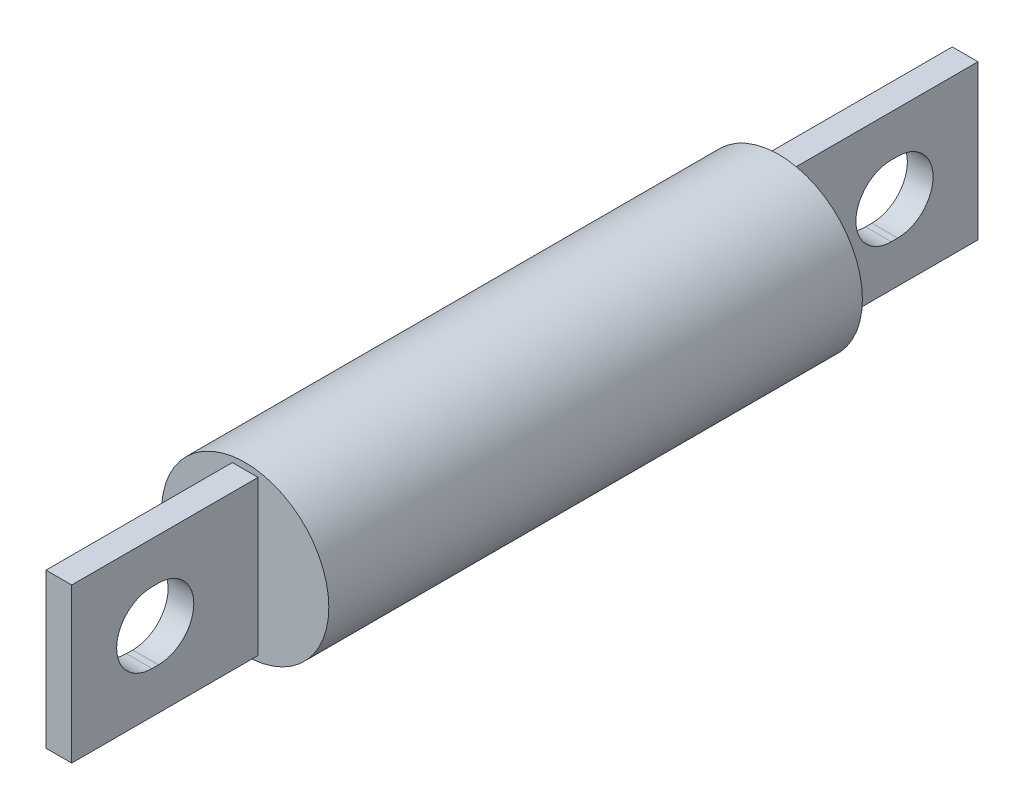
ISO-10303-21;
HEADER;
FILE_DESCRIPTION(('STEP AP214'),'2;1');
FILE_NAME('part.step','',(''),(''),'','','');
FILE_SCHEMA(('AUTOMOTIVE_DESIGN { 1 0 10303 214 1 1 1 1 }'));
ENDSEC;
DATA;
#1=APPLICATION_CONTEXT('core data for automotive mechanical design processes');
#2=APPLICATION_PROTOCOL_DEFINITION('international standard','automotive_design',2000,#1);
#3=PRODUCT_CONTEXT('',#1,'mechanical');
#4=PRODUCT('Part','Part','',(#3));
#5=PRODUCT_RELATED_PRODUCT_CATEGORY('part','',(#4));
#6=PRODUCT_DEFINITION_FORMATION('','',#4);
#7=PRODUCT_DEFINITION_CONTEXT('part definition',#1,'design');
#8=PRODUCT_DEFINITION('design','',#6,#7);
#9=PRODUCT_DEFINITION_SHAPE('','',#8);
#10=(LENGTH_UNIT() NAMED_UNIT(*) SI_UNIT(.MILLI.,.METRE.));
#11=(NAMED_UNIT(*) PLANE_ANGLE_UNIT() SI_UNIT($,.RADIAN.));
#12=(NAMED_UNIT(*) SI_UNIT($,.STERADIAN.) SOLID_ANGLE_UNIT());
#13=UNCERTAINTY_MEASURE_WITH_UNIT(LENGTH_MEASURE(1.E-05),#10,'distance_accuracy_value','');
#14=(GEOMETRIC_REPRESENTATION_CONTEXT(3) GLOBAL_UNCERTAINTY_ASSIGNED_CONTEXT((#13)) GLOBAL_UNIT_ASSIGNED_CONTEXT((#10,
#11,#12)) REPRESENTATION_CONTEXT('',''));
#15=CARTESIAN_POINT('',(0.,0.,0.));
#16=DIRECTION('',(0.,0.,1.));
#17=DIRECTION('',(1.,0.,0.));
#18=AXIS2_PLACEMENT_3D('',#15,#16,#17);
#19=CARTESIAN_POINT('',(0.,0.,32.9438));
#20=DIRECTION('',(0.,0.,1.));
#21=DIRECTION('',(1.,0.,0.));
#22=AXIS2_PLACEMENT_3D('',#19,#20,#21);
#23=PLANE('',#22);
#24=CARTESIAN_POINT('',(0.,0.,32.9438));
#25=DIRECTION('',(0.,0.,1.));
#26=DIRECTION('',(1.,0.,0.));
#27=AXIS2_PLACEMENT_3D('',#24,#25,#26);
#28=CIRCLE('',#27,10.325);
#29=CARTESIAN_POINT('',(10.325,0.,32.9438));
#30=VERTEX_POINT('',#29);
#31=EDGE_CURVE('E11',#30,#30,#28,.T.);
#32=ORIENTED_EDGE('',*,*,#31,.T.);
#33=EDGE_LOOP('',(#32));
#34=FACE_BOUND('',#33,.T.);
#35=DIRECTION('',(-1.,0.,0.));
#36=VECTOR('',#35,1.);
#37=CARTESIAN_POINT('',(1.5875,-9.525,32.9438));
#38=LINE('',#37,#36);
#39=CARTESIAN_POINT('',(1.5875,-9.525,32.9438));
#40=VERTEX_POINT('',#39);
#41=CARTESIAN_POINT('',(-1.5875,-9.525,32.9438));
#42=VERTEX_POINT('',#41);
#43=EDGE_CURVE('E261',#40,#42,#38,.T.);
#44=ORIENTED_EDGE('',*,*,#43,.T.);
#45=DIRECTION('',(0.,1.,0.));
#46=VECTOR('',#45,1.);
#47=CARTESIAN_POINT('',(-1.5875,9.525,32.9438));
#48=LINE('',#47,#46);
#49=CARTESIAN_POINT('',(-1.5875,9.525,32.9438));
#50=VERTEX_POINT('',#49);
#51=EDGE_CURVE('E59',#42,#50,#48,.T.);
#52=ORIENTED_EDGE('',*,*,#51,.T.);
#53=DIRECTION('',(-1.,0.,0.));
#54=VECTOR('',#53,1.);
#55=CARTESIAN_POINT('',(1.5875,9.525,32.9438));
#56=LINE('',#55,#54);
#57=CARTESIAN_POINT('',(1.5875,9.525,32.9438));
#58=VERTEX_POINT('',#57);
#59=EDGE_CURVE('E276',#58,#50,#56,.T.);
#60=ORIENTED_EDGE('',*,*,#59,.F.);
#61=DIRECTION('',(0.,1.,0.));
#62=VECTOR('',#61,1.);
#63=CARTESIAN_POINT('',(1.5875,9.525,32.9438));
#64=LINE('',#63,#62);
#65=EDGE_CURVE('E251',#40,#58,#64,.T.);
#66=ORIENTED_EDGE('',*,*,#65,.F.);
#67=EDGE_LOOP('',(#44,#52,#60,#66));
#68=FACE_BOUND('',#67,.T.);
#69=ADVANCED_FACE('F36',(#34,#68),#23,.T.);
#70=CARTESIAN_POINT('',(0.,0.,32.9438));
#71=DIRECTION('',(0.,0.,-1.));
#72=DIRECTION('',(-1.,0.,0.));
#73=AXIS2_PLACEMENT_3D('',#70,#71,#72);
#74=CYLINDRICAL_SURFACE('',#73,10.325);
#75=ORIENTED_EDGE('',*,*,#31,.F.);
#76=EDGE_LOOP('',(#75));
#77=FACE_BOUND('',#76,.T.);
#78=CARTESIAN_POINT('',(0.,0.,-32.9438));
#79=DIRECTION('',(0.,0.,1.));
#80=DIRECTION('',(1.,0.,0.));
#81=AXIS2_PLACEMENT_3D('',#78,#79,#80);
#82=CIRCLE('',#81,10.325);
#83=CARTESIAN_POINT('',(10.325,0.,-32.9438));
#84=VERTEX_POINT('',#83);
#85=EDGE_CURVE('E40',#84,#84,#82,.T.);
#86=ORIENTED_EDGE('',*,*,#85,.T.);
#87=EDGE_LOOP('',(#86));
#88=FACE_BOUND('',#87,.T.);
#89=ADVANCED_FACE('F38',(#77,#88),#74,.T.);
#90=CARTESIAN_POINT('',(0.,0.,-32.9438));
#91=DIRECTION('',(0.,0.,1.));
#92=DIRECTION('',(1.,0.,0.));
#93=AXIS2_PLACEMENT_3D('',#90,#91,#92);
#94=PLANE('',#93);
#95=DIRECTION('',(-1.,0.,0.));
#96=VECTOR('',#95,1.);
#97=CARTESIAN_POINT('',(1.5875,9.525,-32.9438));
#98=LINE('',#97,#96);
#99=CARTESIAN_POINT('',(1.5875,9.525,-32.9438));
#100=VERTEX_POINT('',#99);
#101=CARTESIAN_POINT('',(-1.5875,9.525,-32.9438));
#102=VERTEX_POINT('',#101);
#103=EDGE_CURVE('E217',#100,#102,#98,.T.);
#104=ORIENTED_EDGE('',*,*,#103,.T.);
#105=DIRECTION('',(0.,-1.,0.));
#106=VECTOR('',#105,1.);
#107=CARTESIAN_POINT('',(-1.5875,9.525,-32.9438));
#108=LINE('',#107,#106);
#109=CARTESIAN_POINT('',(-1.5875,-9.52499999999998,-32.9438));
#110=VERTEX_POINT('',#109);
#111=EDGE_CURVE('E205',#102,#110,#108,.T.);
#112=ORIENTED_EDGE('',*,*,#111,.T.);
#113=DIRECTION('',(-1.,0.,0.));
#114=VECTOR('',#113,1.);
#115=CARTESIAN_POINT('',(1.5875,-9.52499999999998,-32.9438));
#116=LINE('',#115,#114);
#117=CARTESIAN_POINT('',(1.5875,-9.52499999999998,-32.9438));
#118=VERTEX_POINT('',#117);
#119=EDGE_CURVE('E215',#118,#110,#116,.T.);
#120=ORIENTED_EDGE('',*,*,#119,.F.);
#121=DIRECTION('',(0.,-1.,0.));
#122=VECTOR('',#121,1.);
#123=CARTESIAN_POINT('',(1.5875,9.525,-32.9438));
#124=LINE('',#123,#122);
#125=EDGE_CURVE('E196',#100,#118,#124,.T.);
#126=ORIENTED_EDGE('',*,*,#125,.F.);
#127=EDGE_LOOP('',(#104,#112,#120,#126));
#128=FACE_BOUND('',#127,.T.);
#129=ORIENTED_EDGE('',*,*,#85,.F.);
#130=EDGE_LOOP('',(#129));
#131=FACE_BOUND('',#130,.T.);
#132=ADVANCED_FACE('F284',(#128,#131),#94,.F.);
#133=CARTESIAN_POINT('',(1.5875,0.,0.));
#134=DIRECTION('',(-1.,0.,0.));
#135=DIRECTION('',(0.,0.,1.));
#136=AXIS2_PLACEMENT_3D('',#133,#134,#135);
#137=PLANE('',#136);
#138=ORIENTED_EDGE('',*,*,#65,.T.);
#139=DIRECTION('',(0.,0.,1.));
#140=VECTOR('',#139,1.);
#141=CARTESIAN_POINT('',(1.5875,9.525,32.9438));
#142=LINE('',#141,#140);
#143=CARTESIAN_POINT('',(1.5875,9.525,55.9562));
#144=VERTEX_POINT('',#143);
#145=EDGE_CURVE('E254',#58,#144,#142,.T.);
#146=ORIENTED_EDGE('',*,*,#145,.T.);
#147=DIRECTION('',(0.,-1.,0.));
#148=VECTOR('',#147,1.);
#149=CARTESIAN_POINT('',(1.5875,9.525,55.9562));
#150=LINE('',#149,#148);
#151=CARTESIAN_POINT('',(1.5875,-9.525,55.9562));
#152=VERTEX_POINT('',#151);
#153=EDGE_CURVE('E257',#144,#152,#150,.T.);
#154=ORIENTED_EDGE('',*,*,#153,.T.);
#155=DIRECTION('',(0.,0.,-1.));
#156=VECTOR('',#155,1.);
#157=CARTESIAN_POINT('',(1.5875,-9.525,32.9438));
#158=LINE('',#157,#156);
#159=EDGE_CURVE('E259',#152,#40,#158,.T.);
#160=ORIENTED_EDGE('',*,*,#159,.T.);
#161=EDGE_LOOP('',(#138,#146,#154,#160));
#162=FACE_BOUND('',#161,.T.);
#163=CARTESIAN_POINT('',(1.5875,0.,45.2501));
#164=DIRECTION('',(1.,0.,0.));
#165=DIRECTION('',(0.,0.,1.));
#166=AXIS2_PLACEMENT_3D('',#163,#164,#165);
#167=CIRCLE('',#166,4.3688);
#168=CARTESIAN_POINT('',(1.5875,-4.3688,45.2501));
#169=VERTEX_POINT('',#168);
#170=CARTESIAN_POINT('',(1.5875,4.3688,45.2501));
#171=VERTEX_POINT('',#170);
#172=EDGE_CURVE('E221',#169,#171,#167,.T.);
#173=ORIENTED_EDGE('',*,*,#172,.F.);
#174=DIRECTION('',(0.,0.,-1.));
#175=VECTOR('',#174,1.);
#176=CARTESIAN_POINT('',(1.5875,-4.3688,45.2501));
#177=LINE('',#176,#175);
#178=CARTESIAN_POINT('',(1.5875,-4.3688,46.0375));
#179=VERTEX_POINT('',#178);
#180=EDGE_CURVE('E229',#179,#169,#177,.T.);
#181=ORIENTED_EDGE('',*,*,#180,.F.);
#182=CARTESIAN_POINT('',(1.5875,0.,46.0375));
#183=DIRECTION('',(1.,0.,0.));
#184=DIRECTION('',(0.,0.,-1.));
#185=AXIS2_PLACEMENT_3D('',#182,#183,#184);
#186=CIRCLE('',#185,4.3688);
#187=CARTESIAN_POINT('',(1.5875,4.3688,46.0375));
#188=VERTEX_POINT('',#187);
#189=EDGE_CURVE('E226',#188,#179,#186,.T.);
#190=ORIENTED_EDGE('',*,*,#189,.F.);
#191=DIRECTION('',(0.,0.,1.));
#192=VECTOR('',#191,1.);
#193=CARTESIAN_POINT('',(1.5875,4.3688,45.2501));
#194=LINE('',#193,#192);
#195=EDGE_CURVE('E223',#171,#188,#194,.T.);
#196=ORIENTED_EDGE('',*,*,#195,.F.);
#197=EDGE_LOOP('',(#173,#181,#190,#196));
#198=FACE_BOUND('',#197,.T.);
#199=ADVANCED_FACE('F286',(#162,#198),#137,.F.);
#200=CARTESIAN_POINT('',(-1.5875,0.,0.));
#201=DIRECTION('',(-1.,0.,0.));
#202=DIRECTION('',(0.,0.,1.));
#203=AXIS2_PLACEMENT_3D('',#200,#201,#202);
#204=PLANE('',#203);
#205=ORIENTED_EDGE('',*,*,#51,.F.);
#206=DIRECTION('',(0.,0.,-1.));
#207=VECTOR('',#206,1.);
#208=CARTESIAN_POINT('',(-1.5875,-9.525,32.9438));
#209=LINE('',#208,#207);
#210=CARTESIAN_POINT('',(-1.5875,-9.525,55.9562));
#211=VERTEX_POINT('',#210);
#212=EDGE_CURVE('E255',#211,#42,#209,.T.);
#213=ORIENTED_EDGE('',*,*,#212,.F.);
#214=DIRECTION('',(0.,-1.,0.));
#215=VECTOR('',#214,1.);
#216=CARTESIAN_POINT('',(-1.5875,9.525,55.9562));
#217=LINE('',#216,#215);
#218=CARTESIAN_POINT('',(-1.5875,9.525,55.9562));
#219=VERTEX_POINT('',#218);
#220=EDGE_CURVE('E265',#219,#211,#217,.T.);
#221=ORIENTED_EDGE('',*,*,#220,.F.);
#222=DIRECTION('',(0.,0.,1.));
#223=VECTOR('',#222,1.);
#224=CARTESIAN_POINT('',(-1.5875,9.525,32.9438));
#225=LINE('',#224,#223);
#226=EDGE_CURVE('E263',#50,#219,#225,.T.);
#227=ORIENTED_EDGE('',*,*,#226,.F.);
#228=EDGE_LOOP('',(#205,#213,#221,#227));
#229=FACE_BOUND('',#228,.T.);
#230=DIRECTION('',(0.,0.,-1.));
#231=VECTOR('',#230,1.);
#232=CARTESIAN_POINT('',(-1.5875,-4.3688,45.2501));
#233=LINE('',#232,#231);
#234=CARTESIAN_POINT('',(-1.5875,-4.3688,46.0375));
#235=VERTEX_POINT('',#234);
#236=CARTESIAN_POINT('',(-1.5875,-4.3688,45.2501));
#237=VERTEX_POINT('',#236);
#238=EDGE_CURVE('E224',#235,#237,#233,.T.);
#239=ORIENTED_EDGE('',*,*,#238,.T.);
#240=CARTESIAN_POINT('',(-1.5875,0.,45.2501));
#241=DIRECTION('',(1.,0.,0.));
#242=DIRECTION('',(0.,0.,1.));
#243=AXIS2_PLACEMENT_3D('',#240,#241,#242);
#244=CIRCLE('',#243,4.3688);
#245=CARTESIAN_POINT('',(-1.5875,4.3688,45.2501));
#246=VERTEX_POINT('',#245);
#247=EDGE_CURVE('E220',#237,#246,#244,.T.);
#248=ORIENTED_EDGE('',*,*,#247,.T.);
#249=DIRECTION('',(0.,0.,1.));
#250=VECTOR('',#249,1.);
#251=CARTESIAN_POINT('',(-1.5875,4.3688,45.2501));
#252=LINE('',#251,#250);
#253=CARTESIAN_POINT('',(-1.5875,4.3688,46.0375));
#254=VERTEX_POINT('',#253);
#255=EDGE_CURVE('E234',#246,#254,#252,.T.);
#256=ORIENTED_EDGE('',*,*,#255,.T.);
#257=CARTESIAN_POINT('',(-1.5875,0.,46.0375));
#258=DIRECTION('',(1.,0.,0.));
#259=DIRECTION('',(0.,0.,-1.));
#260=AXIS2_PLACEMENT_3D('',#257,#258,#259);
#261=CIRCLE('',#260,4.3688);
#262=EDGE_CURVE('E237',#254,#235,#261,.T.);
#263=ORIENTED_EDGE('',*,*,#262,.T.);
#264=EDGE_LOOP('',(#239,#248,#256,#263));
#265=FACE_BOUND('',#264,.T.);
#266=ADVANCED_FACE('F292',(#229,#265),#204,.T.);
#267=CARTESIAN_POINT('',(1.5875,9.525,32.9438));
#268=DIRECTION('',(0.,-1.,0.));
#269=DIRECTION('',(0.,0.,-1.));
#270=AXIS2_PLACEMENT_3D('',#267,#268,#269);
#271=PLANE('',#270);
#272=ORIENTED_EDGE('',*,*,#226,.T.);
#273=DIRECTION('',(-1.,0.,0.));
#274=VECTOR('',#273,1.);
#275=CARTESIAN_POINT('',(1.5875,9.525,55.9562));
#276=LINE('',#275,#274);
#277=EDGE_CURVE('E273',#144,#219,#276,.T.);
#278=ORIENTED_EDGE('',*,*,#277,.F.);
#279=ORIENTED_EDGE('',*,*,#145,.F.);
#280=ORIENTED_EDGE('',*,*,#59,.T.);
#281=EDGE_LOOP('',(#272,#278,#279,#280));
#282=FACE_BOUND('',#281,.T.);
#283=ADVANCED_FACE('F303',(#282),#271,.F.);
#284=CARTESIAN_POINT('',(1.5875,9.525,55.9562));
#285=DIRECTION('',(0.,0.,-1.));
#286=DIRECTION('',(-1.,0.,0.));
#287=AXIS2_PLACEMENT_3D('',#284,#285,#286);
#288=PLANE('',#287);
#289=ORIENTED_EDGE('',*,*,#220,.T.);
#290=DIRECTION('',(-1.,0.,0.));
#291=VECTOR('',#290,1.);
#292=CARTESIAN_POINT('',(1.5875,-9.525,55.9562));
#293=LINE('',#292,#291);
#294=EDGE_CURVE('E270',#152,#211,#293,.T.);
#295=ORIENTED_EDGE('',*,*,#294,.F.);
#296=ORIENTED_EDGE('',*,*,#153,.F.);
#297=ORIENTED_EDGE('',*,*,#277,.T.);
#298=EDGE_LOOP('',(#289,#295,#296,#297));
#299=FACE_BOUND('',#298,.T.);
#300=ADVANCED_FACE('F306',(#299),#288,.F.);
#301=CARTESIAN_POINT('',(1.5875,-9.525,32.9438));
#302=DIRECTION('',(0.,1.,0.));
#303=DIRECTION('',(0.,0.,1.));
#304=AXIS2_PLACEMENT_3D('',#301,#302,#303);
#305=PLANE('',#304);
#306=ORIENTED_EDGE('',*,*,#212,.T.);
#307=ORIENTED_EDGE('',*,*,#43,.F.);
#308=ORIENTED_EDGE('',*,*,#159,.F.);
#309=ORIENTED_EDGE('',*,*,#294,.T.);
#310=EDGE_LOOP('',(#306,#307,#308,#309));
#311=FACE_BOUND('',#310,.T.);
#312=ADVANCED_FACE('F309',(#311),#305,.F.);
#313=CARTESIAN_POINT('',(1.5875,0.,45.2501));
#314=DIRECTION('',(-1.,0.,0.));
#315=DIRECTION('',(0.,0.,1.));
#316=AXIS2_PLACEMENT_3D('',#313,#314,#315);
#317=CYLINDRICAL_SURFACE('',#316,4.3688);
#318=ORIENTED_EDGE('',*,*,#247,.F.);
#319=DIRECTION('',(-1.,0.,0.));
#320=VECTOR('',#319,1.);
#321=CARTESIAN_POINT('',(1.5875,-4.3688,45.2501));
#322=LINE('',#321,#320);
#323=EDGE_CURVE('E231',#169,#237,#322,.T.);
#324=ORIENTED_EDGE('',*,*,#323,.F.);
#325=ORIENTED_EDGE('',*,*,#172,.T.);
#326=DIRECTION('',(-1.,0.,0.));
#327=VECTOR('',#326,1.);
#328=CARTESIAN_POINT('',(1.5875,4.3688,45.2501));
#329=LINE('',#328,#327);
#330=EDGE_CURVE('E248',#171,#246,#329,.T.);
#331=ORIENTED_EDGE('',*,*,#330,.T.);
#332=EDGE_LOOP('',(#318,#324,#325,#331));
#333=FACE_BOUND('',#332,.T.);
#334=ADVANCED_FACE('F313',(#333),#317,.F.);
#335=CARTESIAN_POINT('',(1.5875,4.3688,45.2501));
#336=DIRECTION('',(0.,-1.,0.));
#337=DIRECTION('',(0.,0.,-1.));
#338=AXIS2_PLACEMENT_3D('',#335,#336,#337);
#339=PLANE('',#338);
#340=ORIENTED_EDGE('',*,*,#255,.F.);
#341=ORIENTED_EDGE('',*,*,#330,.F.);
#342=ORIENTED_EDGE('',*,*,#195,.T.);
#343=DIRECTION('',(-1.,0.,0.));
#344=VECTOR('',#343,1.);
#345=CARTESIAN_POINT('',(1.5875,4.3688,46.0375));
#346=LINE('',#345,#344);
#347=EDGE_CURVE('E246',#188,#254,#346,.T.);
#348=ORIENTED_EDGE('',*,*,#347,.T.);
#349=EDGE_LOOP('',(#340,#341,#342,#348));
#350=FACE_BOUND('',#349,.T.);
#351=ADVANCED_FACE('F319',(#350),#339,.T.);
#352=CARTESIAN_POINT('',(1.5875,0.,46.0375));
#353=DIRECTION('',(-1.,0.,0.));
#354=DIRECTION('',(0.,0.,1.));
#355=AXIS2_PLACEMENT_3D('',#352,#353,#354);
#356=CYLINDRICAL_SURFACE('',#355,4.3688);
#357=ORIENTED_EDGE('',*,*,#262,.F.);
#358=ORIENTED_EDGE('',*,*,#347,.F.);
#359=ORIENTED_EDGE('',*,*,#189,.T.);
#360=DIRECTION('',(-1.,0.,0.));
#361=VECTOR('',#360,1.);
#362=CARTESIAN_POINT('',(1.5875,-4.3688,46.0375));
#363=LINE('',#362,#361);
#364=EDGE_CURVE('E244',#179,#235,#363,.T.);
#365=ORIENTED_EDGE('',*,*,#364,.T.);
#366=EDGE_LOOP('',(#357,#358,#359,#365));
#367=FACE_BOUND('',#366,.T.);
#368=ADVANCED_FACE('F323',(#367),#356,.F.);
#369=CARTESIAN_POINT('',(1.5875,-4.3688,45.2501));
#370=DIRECTION('',(0.,1.,0.));
#371=DIRECTION('',(0.,0.,1.));
#372=AXIS2_PLACEMENT_3D('',#369,#370,#371);
#373=PLANE('',#372);
#374=ORIENTED_EDGE('',*,*,#238,.F.);
#375=ORIENTED_EDGE('',*,*,#364,.F.);
#376=ORIENTED_EDGE('',*,*,#180,.T.);
#377=ORIENTED_EDGE('',*,*,#323,.T.);
#378=EDGE_LOOP('',(#374,#375,#376,#377));
#379=FACE_BOUND('',#378,.T.);
#380=ADVANCED_FACE('F327',(#379),#373,.T.);
#381=CARTESIAN_POINT('',(1.5875,0.,0.));
#382=DIRECTION('',(-1.,0.,0.));
#383=DIRECTION('',(0.,0.,1.));
#384=AXIS2_PLACEMENT_3D('',#381,#382,#383);
#385=PLANE('',#384);
#386=DIRECTION('',(0.,0.,1.));
#387=VECTOR('',#386,1.);
#388=CARTESIAN_POINT('',(1.5875,9.525,-32.9438));
#389=LINE('',#388,#387);
#390=CARTESIAN_POINT('',(1.5875,9.525,-55.9562));
#391=VERTEX_POINT('',#390);
#392=EDGE_CURVE('E194',#391,#100,#389,.T.);
#393=ORIENTED_EDGE('',*,*,#392,.T.);
#394=ORIENTED_EDGE('',*,*,#125,.T.);
#395=DIRECTION('',(0.,0.,-1.));
#396=VECTOR('',#395,1.);
#397=CARTESIAN_POINT('',(1.5875,-9.52499999999998,-32.9438));
#398=LINE('',#397,#396);
#399=CARTESIAN_POINT('',(1.5875,-9.52499999999999,-55.9562));
#400=VERTEX_POINT('',#399);
#401=EDGE_CURVE('E199',#118,#400,#398,.T.);
#402=ORIENTED_EDGE('',*,*,#401,.T.);
#403=DIRECTION('',(0.,1.,0.));
#404=VECTOR('',#403,1.);
#405=CARTESIAN_POINT('',(1.5875,9.525,-55.9562));
#406=LINE('',#405,#404);
#407=EDGE_CURVE('E201',#400,#391,#406,.T.);
#408=ORIENTED_EDGE('',*,*,#407,.T.);
#409=EDGE_LOOP('',(#393,#394,#402,#408));
#410=FACE_BOUND('',#409,.T.);
#411=CARTESIAN_POINT('',(1.5875,0.,-45.2501));
#412=DIRECTION('',(1.,0.,0.));
#413=DIRECTION('',(0.,0.,-1.));
#414=AXIS2_PLACEMENT_3D('',#411,#412,#413);
#415=CIRCLE('',#414,4.3688);
#416=CARTESIAN_POINT('',(1.5875,4.36880000000001,-45.2501));
#417=VERTEX_POINT('',#416);
#418=CARTESIAN_POINT('',(1.5875,-4.36879999999999,-45.2501));
#419=VERTEX_POINT('',#418);
#420=EDGE_CURVE('E153',#417,#419,#415,.T.);
#421=ORIENTED_EDGE('',*,*,#420,.F.);
#422=DIRECTION('',(0.,0.,1.));
#423=VECTOR('',#422,1.);
#424=CARTESIAN_POINT('',(1.5875,4.36880000000001,-45.2501));
#425=LINE('',#424,#423);
#426=CARTESIAN_POINT('',(1.5875,4.36880000000001,-46.0375));
#427=VERTEX_POINT('',#426);
#428=EDGE_CURVE('E178',#427,#417,#425,.T.);
#429=ORIENTED_EDGE('',*,*,#428,.F.);
#430=CARTESIAN_POINT('',(1.5875,0.,-46.0375));
#431=DIRECTION('',(1.,0.,0.));
#432=DIRECTION('',(0.,0.,1.));
#433=AXIS2_PLACEMENT_3D('',#430,#431,#432);
#434=CIRCLE('',#433,4.3688);
#435=CARTESIAN_POINT('',(1.5875,-4.36879999999999,-46.0375));
#436=VERTEX_POINT('',#435);
#437=EDGE_CURVE('E176',#436,#427,#434,.T.);
#438=ORIENTED_EDGE('',*,*,#437,.F.);
#439=DIRECTION('',(0.,0.,-1.));
#440=VECTOR('',#439,1.);
#441=CARTESIAN_POINT('',(1.5875,-4.36879999999999,-45.2501));
#442=LINE('',#441,#440);
#443=EDGE_CURVE('E163',#419,#436,#442,.T.);
#444=ORIENTED_EDGE('',*,*,#443,.F.);
#445=EDGE_LOOP('',(#421,#429,#438,#444));
#446=FACE_BOUND('',#445,.T.);
#447=ADVANCED_FACE('F174',(#410,#446),#385,.F.);
#448=CARTESIAN_POINT('',(-1.5875,0.,0.));
#449=DIRECTION('',(-1.,0.,0.));
#450=DIRECTION('',(0.,0.,1.));
#451=AXIS2_PLACEMENT_3D('',#448,#449,#450);
#452=PLANE('',#451);
#453=DIRECTION('',(0.,0.,1.));
#454=VECTOR('',#453,1.);
#455=CARTESIAN_POINT('',(-1.5875,9.525,-32.9438));
#456=LINE('',#455,#454);
#457=CARTESIAN_POINT('',(-1.5875,9.525,-55.9562));
#458=VERTEX_POINT('',#457);
#459=EDGE_CURVE('E51',#458,#102,#456,.T.);
#460=ORIENTED_EDGE('',*,*,#459,.F.);
#461=DIRECTION('',(0.,1.,0.));
#462=VECTOR('',#461,1.);
#463=CARTESIAN_POINT('',(-1.5875,9.525,-55.9562));
#464=LINE('',#463,#462);
#465=CARTESIAN_POINT('',(-1.5875,-9.52499999999999,-55.9562));
#466=VERTEX_POINT('',#465);
#467=EDGE_CURVE('E197',#466,#458,#464,.T.);
#468=ORIENTED_EDGE('',*,*,#467,.F.);
#469=DIRECTION('',(0.,0.,-1.));
#470=VECTOR('',#469,1.);
#471=CARTESIAN_POINT('',(-1.5875,-9.52499999999998,-32.9438));
#472=LINE('',#471,#470);
#473=EDGE_CURVE('E208',#110,#466,#472,.T.);
#474=ORIENTED_EDGE('',*,*,#473,.F.);
#475=ORIENTED_EDGE('',*,*,#111,.F.);
#476=EDGE_LOOP('',(#460,#468,#474,#475));
#477=FACE_BOUND('',#476,.T.);
#478=DIRECTION('',(0.,0.,1.));
#479=VECTOR('',#478,1.);
#480=CARTESIAN_POINT('',(-1.5875,4.36880000000001,-45.2501));
#481=LINE('',#480,#479);
#482=CARTESIAN_POINT('',(-1.5875,4.36880000000001,-46.0375));
#483=VERTEX_POINT('',#482);
#484=CARTESIAN_POINT('',(-1.5875,4.36880000000001,-45.2501));
#485=VERTEX_POINT('',#484);
#486=EDGE_CURVE('E164',#483,#485,#481,.T.);
#487=ORIENTED_EDGE('',*,*,#486,.T.);
#488=CARTESIAN_POINT('',(-1.5875,0.,-45.2501));
#489=DIRECTION('',(1.,0.,0.));
#490=DIRECTION('',(0.,0.,-1.));
#491=AXIS2_PLACEMENT_3D('',#488,#489,#490);
#492=CIRCLE('',#491,4.3688);
#493=CARTESIAN_POINT('',(-1.5875,-4.36879999999999,-45.2501));
#494=VERTEX_POINT('',#493);
#495=EDGE_CURVE('E182',#485,#494,#492,.T.);
#496=ORIENTED_EDGE('',*,*,#495,.T.);
#497=DIRECTION('',(0.,0.,-1.));
#498=VECTOR('',#497,1.);
#499=CARTESIAN_POINT('',(-1.5875,-4.36879999999999,-45.2501));
#500=LINE('',#499,#498);
#501=CARTESIAN_POINT('',(-1.5875,-4.36879999999999,-46.0375));
#502=VERTEX_POINT('',#501);
#503=EDGE_CURVE('E170',#494,#502,#500,.T.);
#504=ORIENTED_EDGE('',*,*,#503,.T.);
#505=CARTESIAN_POINT('',(-1.5875,0.,-46.0375));
#506=DIRECTION('',(1.,0.,0.));
#507=DIRECTION('',(0.,0.,1.));
#508=AXIS2_PLACEMENT_3D('',#505,#506,#507);
#509=CIRCLE('',#508,4.3688);
#510=EDGE_CURVE('E185',#502,#483,#509,.T.);
#511=ORIENTED_EDGE('',*,*,#510,.T.);
#512=EDGE_LOOP('',(#487,#496,#504,#511));
#513=FACE_BOUND('',#512,.T.);
#514=ADVANCED_FACE('F336',(#477,#513),#452,.T.);
#515=CARTESIAN_POINT('',(1.5875,9.525,-32.9438));
#516=DIRECTION('',(0.,-1.,0.));
#517=DIRECTION('',(0.,0.,-1.));
#518=AXIS2_PLACEMENT_3D('',#515,#516,#517);
#519=PLANE('',#518);
#520=ORIENTED_EDGE('',*,*,#459,.T.);
#521=ORIENTED_EDGE('',*,*,#103,.F.);
#522=ORIENTED_EDGE('',*,*,#392,.F.);
#523=DIRECTION('',(-1.,0.,0.));
#524=VECTOR('',#523,1.);
#525=CARTESIAN_POINT('',(1.5875,9.525,-55.9562));
#526=LINE('',#525,#524);
#527=EDGE_CURVE('E203',#391,#458,#526,.T.);
#528=ORIENTED_EDGE('',*,*,#527,.T.);
#529=EDGE_LOOP('',(#520,#521,#522,#528));
#530=FACE_BOUND('',#529,.T.);
#531=ADVANCED_FACE('F332',(#530),#519,.F.);
#532=CARTESIAN_POINT('',(1.5875,-9.52499999999998,-32.9438));
#533=DIRECTION('',(0.,1.,0.));
#534=DIRECTION('',(0.,0.,1.));
#535=AXIS2_PLACEMENT_3D('',#532,#533,#534);
#536=PLANE('',#535);
#537=ORIENTED_EDGE('',*,*,#473,.T.);
#538=DIRECTION('',(-1.,0.,0.));
#539=VECTOR('',#538,1.);
#540=CARTESIAN_POINT('',(1.5875,-9.52499999999999,-55.9562));
#541=LINE('',#540,#539);
#542=EDGE_CURVE('E212',#400,#466,#541,.T.);
#543=ORIENTED_EDGE('',*,*,#542,.F.);
#544=ORIENTED_EDGE('',*,*,#401,.F.);
#545=ORIENTED_EDGE('',*,*,#119,.T.);
#546=EDGE_LOOP('',(#537,#543,#544,#545));
#547=FACE_BOUND('',#546,.T.);
#548=ADVANCED_FACE('F335',(#547),#536,.F.);
#549=CARTESIAN_POINT('',(1.5875,9.525,-55.9562));
#550=DIRECTION('',(0.,0.,1.));
#551=DIRECTION('',(1.,0.,0.));
#552=AXIS2_PLACEMENT_3D('',#549,#550,#551);
#553=PLANE('',#552);
#554=ORIENTED_EDGE('',*,*,#467,.T.);
#555=ORIENTED_EDGE('',*,*,#527,.F.);
#556=ORIENTED_EDGE('',*,*,#407,.F.);
#557=ORIENTED_EDGE('',*,*,#542,.T.);
#558=EDGE_LOOP('',(#554,#555,#556,#557));
#559=FACE_BOUND('',#558,.T.);
#560=ADVANCED_FACE('F339',(#559),#553,.F.);
#561=CARTESIAN_POINT('',(1.5875,0.,-45.2501));
#562=DIRECTION('',(-1.,0.,0.));
#563=DIRECTION('',(0.,0.,1.));
#564=AXIS2_PLACEMENT_3D('',#561,#562,#563);
#565=CYLINDRICAL_SURFACE('',#564,4.3688);
#566=ORIENTED_EDGE('',*,*,#495,.F.);
#567=DIRECTION('',(-1.,0.,0.));
#568=VECTOR('',#567,1.);
#569=CARTESIAN_POINT('',(1.5875,4.36880000000001,-45.2501));
#570=LINE('',#569,#568);
#571=EDGE_CURVE('E159',#417,#485,#570,.T.);
#572=ORIENTED_EDGE('',*,*,#571,.F.);
#573=ORIENTED_EDGE('',*,*,#420,.T.);
#574=DIRECTION('',(-1.,0.,0.));
#575=VECTOR('',#574,1.);
#576=CARTESIAN_POINT('',(1.5875,-4.36879999999999,-45.2501));
#577=LINE('',#576,#575);
#578=EDGE_CURVE('E156',#419,#494,#577,.T.);
#579=ORIENTED_EDGE('',*,*,#578,.T.);
#580=EDGE_LOOP('',(#566,#572,#573,#579));
#581=FACE_BOUND('',#580,.T.);
#582=ADVANCED_FACE('F155',(#581),#565,.F.);
#583=CARTESIAN_POINT('',(1.5875,-4.36879999999999,-45.2501));
#584=DIRECTION('',(0.,1.,0.));
#585=DIRECTION('',(0.,0.,1.));
#586=AXIS2_PLACEMENT_3D('',#583,#584,#585);
#587=PLANE('',#586);
#588=ORIENTED_EDGE('',*,*,#503,.F.);
#589=ORIENTED_EDGE('',*,*,#578,.F.);
#590=ORIENTED_EDGE('',*,*,#443,.T.);
#591=DIRECTION('',(-1.,0.,0.));
#592=VECTOR('',#591,1.);
#593=CARTESIAN_POINT('',(1.5875,-4.36879999999999,-46.0375));
#594=LINE('',#593,#592);
#595=EDGE_CURVE('E171',#436,#502,#594,.T.);
#596=ORIENTED_EDGE('',*,*,#595,.T.);
#597=EDGE_LOOP('',(#588,#589,#590,#596));
#598=FACE_BOUND('',#597,.T.);
#599=ADVANCED_FACE('F167',(#598),#587,.T.);
#600=CARTESIAN_POINT('',(1.5875,0.,-46.0375));
#601=DIRECTION('',(-1.,0.,0.));
#602=DIRECTION('',(0.,0.,1.));
#603=AXIS2_PLACEMENT_3D('',#600,#601,#602);
#604=CYLINDRICAL_SURFACE('',#603,4.3688);
#605=ORIENTED_EDGE('',*,*,#510,.F.);
#606=ORIENTED_EDGE('',*,*,#595,.F.);
#607=ORIENTED_EDGE('',*,*,#437,.T.);
#608=DIRECTION('',(-1.,0.,0.));
#609=VECTOR('',#608,1.);
#610=CARTESIAN_POINT('',(1.5875,4.36880000000001,-46.0375));
#611=LINE('',#610,#609);
#612=EDGE_CURVE('E191',#427,#483,#611,.T.);
#613=ORIENTED_EDGE('',*,*,#612,.T.);
#614=EDGE_LOOP('',(#605,#606,#607,#613));
#615=FACE_BOUND('',#614,.T.);
#616=ADVANCED_FACE('F354',(#615),#604,.F.);
#617=CARTESIAN_POINT('',(1.5875,4.36880000000001,-45.2501));
#618=DIRECTION('',(0.,-1.,0.));
#619=DIRECTION('',(0.,0.,-1.));
#620=AXIS2_PLACEMENT_3D('',#617,#618,#619);
#621=PLANE('',#620);
#622=ORIENTED_EDGE('',*,*,#486,.F.);
#623=ORIENTED_EDGE('',*,*,#612,.F.);
#624=ORIENTED_EDGE('',*,*,#428,.T.);
#625=ORIENTED_EDGE('',*,*,#571,.T.);
#626=EDGE_LOOP('',(#622,#623,#624,#625));
#627=FACE_BOUND('',#626,.T.);
#628=ADVANCED_FACE('F357',(#627),#621,.T.);
#629=CLOSED_SHELL('',(#69,#89,#132,#199,#266,#283,#300,#312,#334,#351,#368,#380,#447,#514,#531,
#548,#560,#582,#599,#616,#628));
#630=MANIFOLD_SOLID_BREP('B2',#629);
#631=ADVANCED_BREP_SHAPE_REPRESENTATION('',(#18,#630),#14);
#632=SHAPE_DEFINITION_REPRESENTATION(#9,#631);
ENDSEC;
END-ISO-10303-21;
